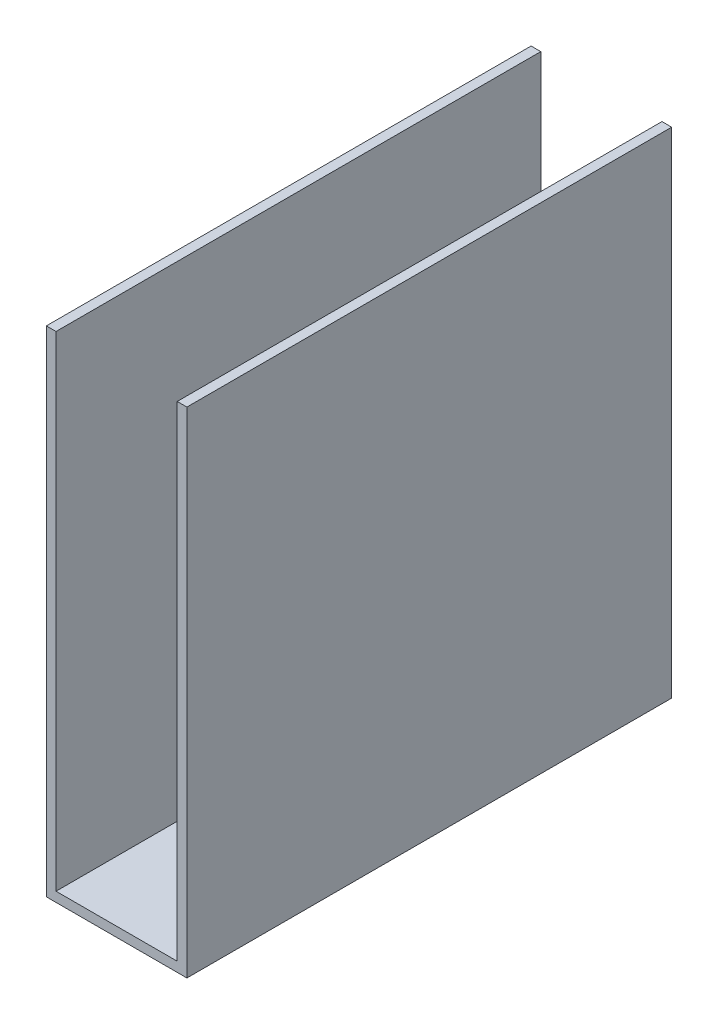
ISO-10303-21;
HEADER;
FILE_DESCRIPTION(('STEP AP214'),'2;1');
FILE_NAME('part.step','',(''),(''),'','','');
FILE_SCHEMA(('AUTOMOTIVE_DESIGN { 1 0 10303 214 1 1 1 1 }'));
ENDSEC;
DATA;
#1=APPLICATION_CONTEXT('core data for automotive mechanical design processes');
#2=APPLICATION_PROTOCOL_DEFINITION('international standard','automotive_design',2000,#1);
#3=PRODUCT_CONTEXT('',#1,'mechanical');
#4=PRODUCT('Part','Part','',(#3));
#5=PRODUCT_RELATED_PRODUCT_CATEGORY('part','',(#4));
#6=PRODUCT_DEFINITION_FORMATION('','',#4);
#7=PRODUCT_DEFINITION_CONTEXT('part definition',#1,'design');
#8=PRODUCT_DEFINITION('design','',#6,#7);
#9=PRODUCT_DEFINITION_SHAPE('','',#8);
#10=(LENGTH_UNIT() NAMED_UNIT(*) SI_UNIT(.MILLI.,.METRE.));
#11=(NAMED_UNIT(*) PLANE_ANGLE_UNIT() SI_UNIT($,.RADIAN.));
#12=(NAMED_UNIT(*) SI_UNIT($,.STERADIAN.) SOLID_ANGLE_UNIT());
#13=UNCERTAINTY_MEASURE_WITH_UNIT(LENGTH_MEASURE(1.E-05),#10,'distance_accuracy_value','');
#14=(GEOMETRIC_REPRESENTATION_CONTEXT(3) GLOBAL_UNCERTAINTY_ASSIGNED_CONTEXT((#13)) GLOBAL_UNIT_ASSIGNED_CONTEXT((#10,
#11,#12)) REPRESENTATION_CONTEXT('',''));
#15=CARTESIAN_POINT('',(0.,0.,0.));
#16=DIRECTION('',(0.,0.,1.));
#17=DIRECTION('',(1.,0.,0.));
#18=AXIS2_PLACEMENT_3D('',#15,#16,#17);
#19=CARTESIAN_POINT('',(-200.,0.,-10000.));
#20=DIRECTION('',(0.,1.,0.));
#21=DIRECTION('',(0.,0.,1.));
#22=AXIS2_PLACEMENT_3D('',#19,#20,#21);
#23=PLANE('',#22);
#24=DIRECTION('',(-1.,0.,0.));
#25=VECTOR('',#24,1.);
#26=CARTESIAN_POINT('',(-200.,0.,0.));
#27=LINE('',#26,#25);
#28=CARTESIAN_POINT('',(0.,0.,0.));
#29=VERTEX_POINT('',#28);
#30=CARTESIAN_POINT('',(-200.,0.,0.));
#31=VERTEX_POINT('',#30);
#32=EDGE_CURVE('E146',#29,#31,#27,.T.);
#33=ORIENTED_EDGE('',*,*,#32,.F.);
#34=DIRECTION('',(0.,0.,1.));
#35=VECTOR('',#34,1.);
#36=CARTESIAN_POINT('',(0.,0.,-10000.));
#37=LINE('',#36,#35);
#38=CARTESIAN_POINT('',(0.,0.,-10000.));
#39=VERTEX_POINT('',#38);
#40=EDGE_CURVE('E11',#39,#29,#37,.T.);
#41=ORIENTED_EDGE('',*,*,#40,.F.);
#42=DIRECTION('',(-1.,0.,0.));
#43=VECTOR('',#42,1.);
#44=CARTESIAN_POINT('',(-200.,0.,-10000.));
#45=LINE('',#44,#43);
#46=CARTESIAN_POINT('',(-200.,0.,-10000.));
#47=VERTEX_POINT('',#46);
#48=EDGE_CURVE('E174',#39,#47,#45,.T.);
#49=ORIENTED_EDGE('',*,*,#48,.T.);
#50=DIRECTION('',(0.,0.,1.));
#51=VECTOR('',#50,1.);
#52=CARTESIAN_POINT('',(-200.,0.,-10000.));
#53=LINE('',#52,#51);
#54=EDGE_CURVE('E46',#47,#31,#53,.T.);
#55=ORIENTED_EDGE('',*,*,#54,.T.);
#56=EDGE_LOOP('',(#33,#41,#49,#55));
#57=FACE_BOUND('',#56,.T.);
#58=ADVANCED_FACE('F43',(#57),#23,.T.);
#59=CARTESIAN_POINT('',(0.,0.,-10000.));
#60=DIRECTION('',(1.,0.,0.));
#61=DIRECTION('',(0.,1.,0.));
#62=AXIS2_PLACEMENT_3D('',#59,#60,#61);
#63=PLANE('',#62);
#64=DIRECTION('',(0.,1.,0.));
#65=VECTOR('',#64,1.);
#66=CARTESIAN_POINT('',(0.,0.,0.));
#67=LINE('',#66,#65);
#68=CARTESIAN_POINT('',(1.22464679914735E-12,-10000.,0.));
#69=VERTEX_POINT('',#68);
#70=EDGE_CURVE('E171',#69,#29,#67,.T.);
#71=ORIENTED_EDGE('',*,*,#70,.F.);
#72=DIRECTION('',(0.,0.,1.));
#73=VECTOR('',#72,1.);
#74=CARTESIAN_POINT('',(1.22464679914735E-12,-10000.,-10000.));
#75=LINE('',#74,#73);
#76=CARTESIAN_POINT('',(1.22464679914735E-12,-10000.,-10000.));
#77=VERTEX_POINT('',#76);
#78=EDGE_CURVE('E53',#77,#69,#75,.T.);
#79=ORIENTED_EDGE('',*,*,#78,.F.);
#80=DIRECTION('',(0.,1.,0.));
#81=VECTOR('',#80,1.);
#82=CARTESIAN_POINT('',(0.,0.,-10000.));
#83=LINE('',#82,#81);
#84=EDGE_CURVE('E132',#77,#39,#83,.T.);
#85=ORIENTED_EDGE('',*,*,#84,.T.);
#86=ORIENTED_EDGE('',*,*,#40,.T.);
#87=EDGE_LOOP('',(#71,#79,#85,#86));
#88=FACE_BOUND('',#87,.T.);
#89=ADVANCED_FACE('F192',(#88),#63,.T.);
#90=CARTESIAN_POINT('',(1.22464679914735E-12,-10000.,-10000.));
#91=DIRECTION('',(0.,1.,0.));
#92=DIRECTION('',(0.,0.,1.));
#93=AXIS2_PLACEMENT_3D('',#90,#91,#92);
#94=PLANE('',#93);
#95=DIRECTION('',(-1.,0.,0.));
#96=VECTOR('',#95,1.);
#97=CARTESIAN_POINT('',(1.22464679914735E-12,-10000.,0.));
#98=LINE('',#97,#96);
#99=CARTESIAN_POINT('',(2500.,-10000.,0.));
#100=VERTEX_POINT('',#99);
#101=EDGE_CURVE('E118',#100,#69,#98,.T.);
#102=ORIENTED_EDGE('',*,*,#101,.F.);
#103=DIRECTION('',(0.,0.,1.));
#104=VECTOR('',#103,1.);
#105=CARTESIAN_POINT('',(2500.,-10000.,-10000.));
#106=LINE('',#105,#104);
#107=CARTESIAN_POINT('',(2500.,-10000.,-10000.));
#108=VERTEX_POINT('',#107);
#109=EDGE_CURVE('E113',#108,#100,#106,.T.);
#110=ORIENTED_EDGE('',*,*,#109,.F.);
#111=DIRECTION('',(-1.,0.,0.));
#112=VECTOR('',#111,1.);
#113=CARTESIAN_POINT('',(1.22464679914735E-12,-10000.,-10000.));
#114=LINE('',#113,#112);
#115=EDGE_CURVE('E116',#108,#77,#114,.T.);
#116=ORIENTED_EDGE('',*,*,#115,.T.);
#117=ORIENTED_EDGE('',*,*,#78,.T.);
#118=EDGE_LOOP('',(#102,#110,#116,#117));
#119=FACE_BOUND('',#118,.T.);
#120=ADVANCED_FACE('F115',(#119),#94,.T.);
#121=CARTESIAN_POINT('',(2500.,-10000.,-10000.));
#122=DIRECTION('',(-1.,0.,0.));
#123=DIRECTION('',(0.,0.,1.));
#124=AXIS2_PLACEMENT_3D('',#121,#122,#123);
#125=PLANE('',#124);
#126=DIRECTION('',(0.,-1.,0.));
#127=VECTOR('',#126,1.);
#128=CARTESIAN_POINT('',(2500.,-10000.,0.));
#129=LINE('',#128,#127);
#130=CARTESIAN_POINT('',(2500.,0.,0.));
#131=VERTEX_POINT('',#130);
#132=EDGE_CURVE('E166',#131,#100,#129,.T.);
#133=ORIENTED_EDGE('',*,*,#132,.F.);
#134=DIRECTION('',(0.,0.,1.));
#135=VECTOR('',#134,1.);
#136=CARTESIAN_POINT('',(2500.,0.,-10000.));
#137=LINE('',#136,#135);
#138=CARTESIAN_POINT('',(2500.,0.,-10000.));
#139=VERTEX_POINT('',#138);
#140=EDGE_CURVE('E124',#139,#131,#137,.T.);
#141=ORIENTED_EDGE('',*,*,#140,.F.);
#142=DIRECTION('',(0.,-1.,0.));
#143=VECTOR('',#142,1.);
#144=CARTESIAN_POINT('',(2500.,-10000.,-10000.));
#145=LINE('',#144,#143);
#146=EDGE_CURVE('E130',#139,#108,#145,.T.);
#147=ORIENTED_EDGE('',*,*,#146,.T.);
#148=ORIENTED_EDGE('',*,*,#109,.T.);
#149=EDGE_LOOP('',(#133,#141,#147,#148));
#150=FACE_BOUND('',#149,.T.);
#151=ADVANCED_FACE('F135',(#150),#125,.T.);
#152=CARTESIAN_POINT('',(2500.,0.,-10000.));
#153=DIRECTION('',(0.,1.,0.));
#154=DIRECTION('',(0.,0.,1.));
#155=AXIS2_PLACEMENT_3D('',#152,#153,#154);
#156=PLANE('',#155);
#157=DIRECTION('',(-1.,0.,0.));
#158=VECTOR('',#157,1.);
#159=CARTESIAN_POINT('',(2500.,0.,0.));
#160=LINE('',#159,#158);
#161=CARTESIAN_POINT('',(2700.,0.,0.));
#162=VERTEX_POINT('',#161);
#163=EDGE_CURVE('E162',#162,#131,#160,.T.);
#164=ORIENTED_EDGE('',*,*,#163,.F.);
#165=DIRECTION('',(0.,0.,1.));
#166=VECTOR('',#165,1.);
#167=CARTESIAN_POINT('',(2700.,0.,-10000.));
#168=LINE('',#167,#166);
#169=CARTESIAN_POINT('',(2700.,0.,-10000.));
#170=VERTEX_POINT('',#169);
#171=EDGE_CURVE('E180',#170,#162,#168,.T.);
#172=ORIENTED_EDGE('',*,*,#171,.F.);
#173=DIRECTION('',(-1.,0.,0.));
#174=VECTOR('',#173,1.);
#175=CARTESIAN_POINT('',(2500.,0.,-10000.));
#176=LINE('',#175,#174);
#177=EDGE_CURVE('E137',#170,#139,#176,.T.);
#178=ORIENTED_EDGE('',*,*,#177,.T.);
#179=ORIENTED_EDGE('',*,*,#140,.T.);
#180=EDGE_LOOP('',(#164,#172,#178,#179));
#181=FACE_BOUND('',#180,.T.);
#182=ADVANCED_FACE('F205',(#181),#156,.T.);
#183=CARTESIAN_POINT('',(2700.,-10200.,-10000.));
#184=DIRECTION('',(1.,0.,0.));
#185=DIRECTION('',(0.,0.,-1.));
#186=AXIS2_PLACEMENT_3D('',#183,#184,#185);
#187=PLANE('',#186);
#188=DIRECTION('',(0.,1.,0.));
#189=VECTOR('',#188,1.);
#190=CARTESIAN_POINT('',(2700.,-10200.,0.));
#191=LINE('',#190,#189);
#192=CARTESIAN_POINT('',(2700.,-10200.,0.));
#193=VERTEX_POINT('',#192);
#194=EDGE_CURVE('E158',#193,#162,#191,.T.);
#195=ORIENTED_EDGE('',*,*,#194,.F.);
#196=DIRECTION('',(0.,0.,1.));
#197=VECTOR('',#196,1.);
#198=CARTESIAN_POINT('',(2700.,-10200.,-10000.));
#199=LINE('',#198,#197);
#200=CARTESIAN_POINT('',(2700.,-10200.,-10000.));
#201=VERTEX_POINT('',#200);
#202=EDGE_CURVE('E183',#201,#193,#199,.T.);
#203=ORIENTED_EDGE('',*,*,#202,.F.);
#204=DIRECTION('',(0.,1.,0.));
#205=VECTOR('',#204,1.);
#206=CARTESIAN_POINT('',(2700.,-10200.,-10000.));
#207=LINE('',#206,#205);
#208=EDGE_CURVE('E140',#201,#170,#207,.T.);
#209=ORIENTED_EDGE('',*,*,#208,.T.);
#210=ORIENTED_EDGE('',*,*,#171,.T.);
#211=EDGE_LOOP('',(#195,#203,#209,#210));
#212=FACE_BOUND('',#211,.T.);
#213=ADVANCED_FACE('F208',(#212),#187,.T.);
#214=CARTESIAN_POINT('',(-199.999999999998,-10200.,-10000.));
#215=DIRECTION('',(0.,-1.,0.));
#216=DIRECTION('',(0.,0.,-1.));
#217=AXIS2_PLACEMENT_3D('',#214,#215,#216);
#218=PLANE('',#217);
#219=DIRECTION('',(1.,0.,0.));
#220=VECTOR('',#219,1.);
#221=CARTESIAN_POINT('',(-199.999999999998,-10200.,0.));
#222=LINE('',#221,#220);
#223=CARTESIAN_POINT('',(-199.999999999998,-10200.,0.));
#224=VERTEX_POINT('',#223);
#225=EDGE_CURVE('E154',#224,#193,#222,.T.);
#226=ORIENTED_EDGE('',*,*,#225,.F.);
#227=DIRECTION('',(0.,0.,1.));
#228=VECTOR('',#227,1.);
#229=CARTESIAN_POINT('',(-199.999999999998,-10200.,-10000.));
#230=LINE('',#229,#228);
#231=CARTESIAN_POINT('',(-199.999999999998,-10200.,-10000.));
#232=VERTEX_POINT('',#231);
#233=EDGE_CURVE('E185',#232,#224,#230,.T.);
#234=ORIENTED_EDGE('',*,*,#233,.F.);
#235=DIRECTION('',(1.,0.,0.));
#236=VECTOR('',#235,1.);
#237=CARTESIAN_POINT('',(-199.999999999998,-10200.,-10000.));
#238=LINE('',#237,#236);
#239=EDGE_CURVE('E303',#232,#201,#238,.T.);
#240=ORIENTED_EDGE('',*,*,#239,.T.);
#241=ORIENTED_EDGE('',*,*,#202,.T.);
#242=EDGE_LOOP('',(#226,#234,#240,#241));
#243=FACE_BOUND('',#242,.T.);
#244=ADVANCED_FACE('F212',(#243),#218,.T.);
#245=CARTESIAN_POINT('',(-200.,0.,-10000.));
#246=DIRECTION('',(-1.,0.,0.));
#247=DIRECTION('',(0.,-1.,0.));
#248=AXIS2_PLACEMENT_3D('',#245,#246,#247);
#249=PLANE('',#248);
#250=DIRECTION('',(0.,-1.,0.));
#251=VECTOR('',#250,1.);
#252=CARTESIAN_POINT('',(-200.,0.,0.));
#253=LINE('',#252,#251);
#254=EDGE_CURVE('E150',#31,#224,#253,.T.);
#255=ORIENTED_EDGE('',*,*,#254,.F.);
#256=ORIENTED_EDGE('',*,*,#54,.F.);
#257=DIRECTION('',(0.,-1.,0.));
#258=VECTOR('',#257,1.);
#259=CARTESIAN_POINT('',(-200.,0.,-10000.));
#260=LINE('',#259,#258);
#261=EDGE_CURVE('E306',#47,#232,#260,.T.);
#262=ORIENTED_EDGE('',*,*,#261,.T.);
#263=ORIENTED_EDGE('',*,*,#233,.T.);
#264=EDGE_LOOP('',(#255,#256,#262,#263));
#265=FACE_BOUND('',#264,.T.);
#266=ADVANCED_FACE('F189',(#265),#249,.T.);
#267=CARTESIAN_POINT('',(0.,0.,-10000.));
#268=DIRECTION('',(0.,0.,-1.));
#269=DIRECTION('',(-1.,0.,0.));
#270=AXIS2_PLACEMENT_3D('',#267,#268,#269);
#271=PLANE('',#270);
#272=ORIENTED_EDGE('',*,*,#48,.F.);
#273=ORIENTED_EDGE('',*,*,#84,.F.);
#274=ORIENTED_EDGE('',*,*,#115,.F.);
#275=ORIENTED_EDGE('',*,*,#146,.F.);
#276=ORIENTED_EDGE('',*,*,#177,.F.);
#277=ORIENTED_EDGE('',*,*,#208,.F.);
#278=ORIENTED_EDGE('',*,*,#239,.F.);
#279=ORIENTED_EDGE('',*,*,#261,.F.);
#280=EDGE_LOOP('',(#272,#273,#274,#275,#276,#277,#278,#279));
#281=FACE_BOUND('',#280,.T.);
#282=ADVANCED_FACE('F128',(#281),#271,.T.);
#283=CARTESIAN_POINT('',(0.,0.,0.));
#284=DIRECTION('',(0.,0.,-1.));
#285=DIRECTION('',(-1.,0.,0.));
#286=AXIS2_PLACEMENT_3D('',#283,#284,#285);
#287=PLANE('',#286);
#288=ORIENTED_EDGE('',*,*,#32,.T.);
#289=ORIENTED_EDGE('',*,*,#254,.T.);
#290=ORIENTED_EDGE('',*,*,#225,.T.);
#291=ORIENTED_EDGE('',*,*,#194,.T.);
#292=ORIENTED_EDGE('',*,*,#163,.T.);
#293=ORIENTED_EDGE('',*,*,#132,.T.);
#294=ORIENTED_EDGE('',*,*,#101,.T.);
#295=ORIENTED_EDGE('',*,*,#70,.T.);
#296=EDGE_LOOP('',(#288,#289,#290,#291,#292,#293,#294,#295));
#297=FACE_BOUND('',#296,.T.);
#298=ADVANCED_FACE('F191',(#297),#287,.F.);
#299=CLOSED_SHELL('',(#58,#89,#120,#151,#182,#213,#244,#266,#282,#298));
#300=MANIFOLD_SOLID_BREP('B2',#299);
#301=ADVANCED_BREP_SHAPE_REPRESENTATION('',(#18,#300),#14);
#302=SHAPE_DEFINITION_REPRESENTATION(#9,#301);
ENDSEC;
END-ISO-10303-21;
